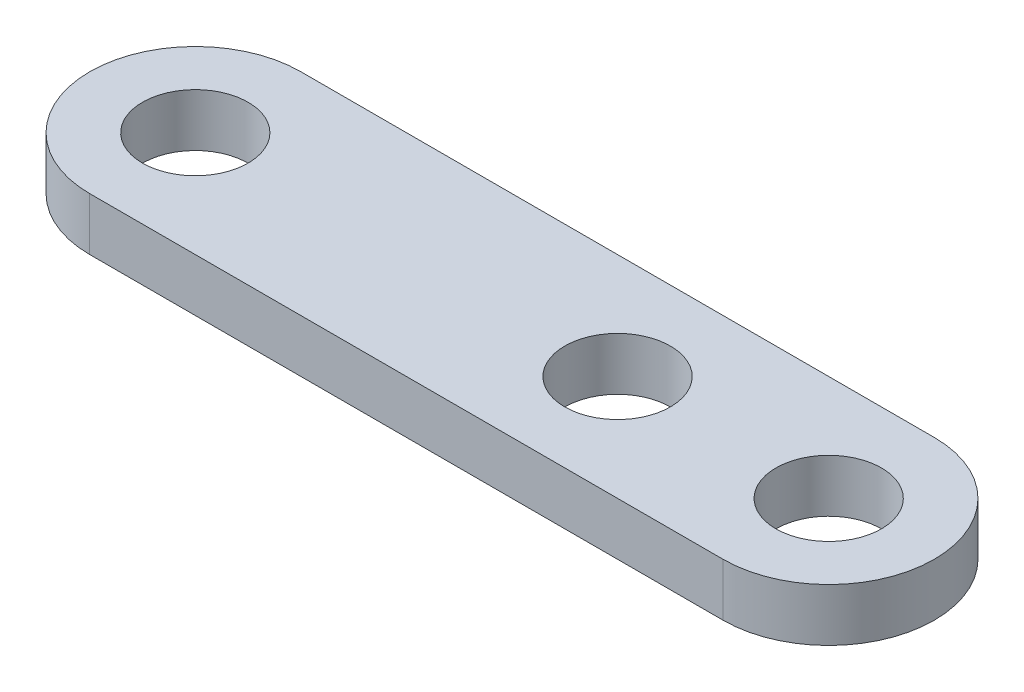
ISO-10303-21;
HEADER;
FILE_DESCRIPTION(('STEP AP214'),'2;1');
FILE_NAME('part.step','',(''),(''),'','','');
FILE_SCHEMA(('AUTOMOTIVE_DESIGN { 1 0 10303 214 1 1 1 1 }'));
ENDSEC;
DATA;
#1=APPLICATION_CONTEXT('core data for automotive mechanical design processes');
#2=APPLICATION_PROTOCOL_DEFINITION('international standard','automotive_design',2000,#1);
#3=PRODUCT_CONTEXT('',#1,'mechanical');
#4=PRODUCT('Part','Part','',(#3));
#5=PRODUCT_RELATED_PRODUCT_CATEGORY('part','',(#4));
#6=PRODUCT_DEFINITION_FORMATION('','',#4);
#7=PRODUCT_DEFINITION_CONTEXT('part definition',#1,'design');
#8=PRODUCT_DEFINITION('design','',#6,#7);
#9=PRODUCT_DEFINITION_SHAPE('','',#8);
#10=(LENGTH_UNIT() NAMED_UNIT(*) SI_UNIT(.MILLI.,.METRE.));
#11=(NAMED_UNIT(*) PLANE_ANGLE_UNIT() SI_UNIT($,.RADIAN.));
#12=(NAMED_UNIT(*) SI_UNIT($,.STERADIAN.) SOLID_ANGLE_UNIT());
#13=UNCERTAINTY_MEASURE_WITH_UNIT(LENGTH_MEASURE(1.E-05),#10,'distance_accuracy_value','');
#14=(GEOMETRIC_REPRESENTATION_CONTEXT(3) GLOBAL_UNCERTAINTY_ASSIGNED_CONTEXT((#13)) GLOBAL_UNIT_ASSIGNED_CONTEXT((#10,
#11,#12)) REPRESENTATION_CONTEXT('',''));
#15=CARTESIAN_POINT('',(0.,0.,0.));
#16=DIRECTION('',(0.,0.,1.));
#17=DIRECTION('',(1.,0.,0.));
#18=AXIS2_PLACEMENT_3D('',#15,#16,#17);
#19=CARTESIAN_POINT('',(-72.3468097091892,5.,0.));
#20=DIRECTION('',(0.,1.,0.));
#21=DIRECTION('',(0.,0.,1.));
#22=AXIS2_PLACEMENT_3D('',#19,#20,#21);
#23=PLANE('',#22);
#24=CARTESIAN_POINT('',(-32.3468097091892,5.,0.));
#25=DIRECTION('',(0.,1.,0.));
#26=DIRECTION('',(0.,0.,1.));
#27=AXIS2_PLACEMENT_3D('',#24,#25,#26);
#28=CIRCLE('',#27,5.);
#29=CARTESIAN_POINT('',(-32.3468097091892,5.,5.));
#30=VERTEX_POINT('',#29);
#31=EDGE_CURVE('E132',#30,#30,#28,.T.);
#32=ORIENTED_EDGE('',*,*,#31,.F.);
#33=EDGE_LOOP('',(#32));
#34=FACE_BOUND('',#33,.T.);
#35=CARTESIAN_POINT('',(-72.3468097091892,5.,0.));
#36=DIRECTION('',(0.,1.,0.));
#37=DIRECTION('',(0.,0.,1.));
#38=AXIS2_PLACEMENT_3D('',#35,#36,#37);
#39=CIRCLE('',#38,5.);
#40=CARTESIAN_POINT('',(-72.3468097091892,5.,5.));
#41=VERTEX_POINT('',#40);
#42=EDGE_CURVE('E109',#41,#41,#39,.T.);
#43=ORIENTED_EDGE('',*,*,#42,.F.);
#44=EDGE_LOOP('',(#43));
#45=FACE_BOUND('',#44,.T.);
#46=CARTESIAN_POINT('',(-72.3468097091892,5.,0.));
#47=DIRECTION('',(0.,1.,0.));
#48=DIRECTION('',(0.,0.,1.));
#49=AXIS2_PLACEMENT_3D('',#46,#47,#48);
#50=CIRCLE('',#49,10.);
#51=CARTESIAN_POINT('',(-72.3468097091892,5.,-10.));
#52=VERTEX_POINT('',#51);
#53=CARTESIAN_POINT('',(-72.3468097091892,5.,10.));
#54=VERTEX_POINT('',#53);
#55=EDGE_CURVE('E93',#52,#54,#50,.T.);
#56=ORIENTED_EDGE('',*,*,#55,.T.);
#57=DIRECTION('',(1.,0.,0.));
#58=VECTOR('',#57,1.);
#59=CARTESIAN_POINT('',(-72.3468097091892,5.,10.));
#60=LINE('',#59,#58);
#61=CARTESIAN_POINT('',(-12.3468097091892,5.,10.));
#62=VERTEX_POINT('',#61);
#63=EDGE_CURVE('E88',#54,#62,#60,.T.);
#64=ORIENTED_EDGE('',*,*,#63,.T.);
#65=CARTESIAN_POINT('',(-12.3468097091892,5.,0.));
#66=DIRECTION('',(0.,1.,0.));
#67=DIRECTION('',(0.,0.,1.));
#68=AXIS2_PLACEMENT_3D('',#65,#66,#67);
#69=CIRCLE('',#68,10.);
#70=CARTESIAN_POINT('',(-12.3468097091892,5.,-10.));
#71=VERTEX_POINT('',#70);
#72=EDGE_CURVE('E91',#62,#71,#69,.T.);
#73=ORIENTED_EDGE('',*,*,#72,.T.);
#74=DIRECTION('',(-1.,0.,0.));
#75=VECTOR('',#74,1.);
#76=CARTESIAN_POINT('',(-72.3468097091892,5.,-10.));
#77=LINE('',#76,#75);
#78=EDGE_CURVE('E58',#71,#52,#77,.T.);
#79=ORIENTED_EDGE('',*,*,#78,.T.);
#80=EDGE_LOOP('',(#56,#64,#73,#79));
#81=FACE_BOUND('',#80,.T.);
#82=CARTESIAN_POINT('',(-12.3468097091892,5.,0.));
#83=DIRECTION('',(0.,1.,0.));
#84=DIRECTION('',(0.,0.,1.));
#85=AXIS2_PLACEMENT_3D('',#82,#83,#84);
#86=CIRCLE('',#85,4.99999999999999);
#87=CARTESIAN_POINT('',(-12.3468097091892,5.,4.99999999999999));
#88=VERTEX_POINT('',#87);
#89=EDGE_CURVE('E124',#88,#88,#86,.T.);
#90=ORIENTED_EDGE('',*,*,#89,.F.);
#91=EDGE_LOOP('',(#90));
#92=FACE_BOUND('',#91,.T.);
#93=ADVANCED_FACE('F40',(#34,#45,#81,#92),#23,.T.);
#94=CARTESIAN_POINT('',(-72.3468097091892,0.,0.));
#95=DIRECTION('',(0.,1.,0.));
#96=DIRECTION('',(0.,0.,1.));
#97=AXIS2_PLACEMENT_3D('',#94,#95,#96);
#98=PLANE('',#97);
#99=CARTESIAN_POINT('',(-32.3468097091892,0.,0.));
#100=DIRECTION('',(0.,1.,0.));
#101=DIRECTION('',(0.,0.,1.));
#102=AXIS2_PLACEMENT_3D('',#99,#100,#101);
#103=CIRCLE('',#102,5.);
#104=CARTESIAN_POINT('',(-32.3468097091892,0.,5.));
#105=VERTEX_POINT('',#104);
#106=EDGE_CURVE('E44',#105,#105,#103,.T.);
#107=ORIENTED_EDGE('',*,*,#106,.T.);
#108=EDGE_LOOP('',(#107));
#109=FACE_BOUND('',#108,.T.);
#110=CARTESIAN_POINT('',(-72.3468097091892,0.,0.));
#111=DIRECTION('',(0.,1.,0.));
#112=DIRECTION('',(0.,0.,1.));
#113=AXIS2_PLACEMENT_3D('',#110,#111,#112);
#114=CIRCLE('',#113,10.);
#115=CARTESIAN_POINT('',(-72.3468097091892,0.,-10.));
#116=VERTEX_POINT('',#115);
#117=CARTESIAN_POINT('',(-72.3468097091892,0.,10.));
#118=VERTEX_POINT('',#117);
#119=EDGE_CURVE('E106',#116,#118,#114,.T.);
#120=ORIENTED_EDGE('',*,*,#119,.F.);
#121=DIRECTION('',(-1.,0.,0.));
#122=VECTOR('',#121,1.);
#123=CARTESIAN_POINT('',(-72.3468097091892,0.,-10.));
#124=LINE('',#123,#122);
#125=CARTESIAN_POINT('',(-12.3468097091892,0.,-10.));
#126=VERTEX_POINT('',#125);
#127=EDGE_CURVE('E81',#126,#116,#124,.T.);
#128=ORIENTED_EDGE('',*,*,#127,.F.);
#129=CARTESIAN_POINT('',(-12.3468097091892,0.,0.));
#130=DIRECTION('',(0.,1.,0.));
#131=DIRECTION('',(0.,0.,1.));
#132=AXIS2_PLACEMENT_3D('',#129,#130,#131);
#133=CIRCLE('',#132,10.);
#134=CARTESIAN_POINT('',(-12.3468097091892,0.,10.));
#135=VERTEX_POINT('',#134);
#136=EDGE_CURVE('E75',#135,#126,#133,.T.);
#137=ORIENTED_EDGE('',*,*,#136,.F.);
#138=DIRECTION('',(1.,0.,0.));
#139=VECTOR('',#138,1.);
#140=CARTESIAN_POINT('',(-72.3468097091892,0.,10.));
#141=LINE('',#140,#139);
#142=EDGE_CURVE('E97',#118,#135,#141,.T.);
#143=ORIENTED_EDGE('',*,*,#142,.F.);
#144=EDGE_LOOP('',(#120,#128,#137,#143));
#145=FACE_BOUND('',#144,.T.);
#146=CARTESIAN_POINT('',(-72.3468097091892,0.,0.));
#147=DIRECTION('',(0.,1.,0.));
#148=DIRECTION('',(0.,0.,1.));
#149=AXIS2_PLACEMENT_3D('',#146,#147,#148);
#150=CIRCLE('',#149,5.);
#151=CARTESIAN_POINT('',(-72.3468097091892,0.,5.));
#152=VERTEX_POINT('',#151);
#153=EDGE_CURVE('E121',#152,#152,#150,.T.);
#154=ORIENTED_EDGE('',*,*,#153,.T.);
#155=EDGE_LOOP('',(#154));
#156=FACE_BOUND('',#155,.T.);
#157=CARTESIAN_POINT('',(-12.3468097091892,0.,0.));
#158=DIRECTION('',(0.,1.,0.));
#159=DIRECTION('',(0.,0.,1.));
#160=AXIS2_PLACEMENT_3D('',#157,#158,#159);
#161=CIRCLE('',#160,4.99999999999999);
#162=CARTESIAN_POINT('',(-12.3468097091892,0.,4.99999999999999));
#163=VERTEX_POINT('',#162);
#164=EDGE_CURVE('E127',#163,#163,#161,.T.);
#165=ORIENTED_EDGE('',*,*,#164,.T.);
#166=EDGE_LOOP('',(#165));
#167=FACE_BOUND('',#166,.T.);
#168=ADVANCED_FACE('F117',(#109,#145,#156,#167),#98,.F.);
#169=CARTESIAN_POINT('',(-72.3468097091892,5.,0.));
#170=DIRECTION('',(0.,-1.,0.));
#171=DIRECTION('',(0.,0.,-1.));
#172=AXIS2_PLACEMENT_3D('',#169,#170,#171);
#173=CYLINDRICAL_SURFACE('',#172,10.);
#174=ORIENTED_EDGE('',*,*,#119,.T.);
#175=DIRECTION('',(0.,-1.,0.));
#176=VECTOR('',#175,1.);
#177=CARTESIAN_POINT('',(-72.3468097091892,5.,10.));
#178=LINE('',#177,#176);
#179=EDGE_CURVE('E11',#54,#118,#178,.T.);
#180=ORIENTED_EDGE('',*,*,#179,.F.);
#181=ORIENTED_EDGE('',*,*,#55,.F.);
#182=DIRECTION('',(0.,-1.,0.));
#183=VECTOR('',#182,1.);
#184=CARTESIAN_POINT('',(-72.3468097091892,5.,-10.));
#185=LINE('',#184,#183);
#186=EDGE_CURVE('E102',#52,#116,#185,.T.);
#187=ORIENTED_EDGE('',*,*,#186,.T.);
#188=EDGE_LOOP('',(#174,#180,#181,#187));
#189=FACE_BOUND('',#188,.T.);
#190=ADVANCED_FACE('F42',(#189),#173,.T.);
#191=CARTESIAN_POINT('',(-72.3468097091892,5.,10.));
#192=DIRECTION('',(0.,0.,-1.));
#193=DIRECTION('',(-1.,0.,0.));
#194=AXIS2_PLACEMENT_3D('',#191,#192,#193);
#195=PLANE('',#194);
#196=ORIENTED_EDGE('',*,*,#142,.T.);
#197=DIRECTION('',(0.,-1.,0.));
#198=VECTOR('',#197,1.);
#199=CARTESIAN_POINT('',(-12.3468097091892,5.,10.));
#200=LINE('',#199,#198);
#201=EDGE_CURVE('E50',#62,#135,#200,.T.);
#202=ORIENTED_EDGE('',*,*,#201,.F.);
#203=ORIENTED_EDGE('',*,*,#63,.F.);
#204=ORIENTED_EDGE('',*,*,#179,.T.);
#205=EDGE_LOOP('',(#196,#202,#203,#204));
#206=FACE_BOUND('',#205,.T.);
#207=ADVANCED_FACE('F96',(#206),#195,.F.);
#208=CARTESIAN_POINT('',(-12.3468097091892,5.,0.));
#209=DIRECTION('',(0.,-1.,0.));
#210=DIRECTION('',(0.,0.,-1.));
#211=AXIS2_PLACEMENT_3D('',#208,#209,#210);
#212=CYLINDRICAL_SURFACE('',#211,10.);
#213=ORIENTED_EDGE('',*,*,#136,.T.);
#214=DIRECTION('',(0.,-1.,0.));
#215=VECTOR('',#214,1.);
#216=CARTESIAN_POINT('',(-12.3468097091892,5.,-10.));
#217=LINE('',#216,#215);
#218=EDGE_CURVE('E98',#71,#126,#217,.T.);
#219=ORIENTED_EDGE('',*,*,#218,.F.);
#220=ORIENTED_EDGE('',*,*,#72,.F.);
#221=ORIENTED_EDGE('',*,*,#201,.T.);
#222=EDGE_LOOP('',(#213,#219,#220,#221));
#223=FACE_BOUND('',#222,.T.);
#224=ADVANCED_FACE('F100',(#223),#212,.T.);
#225=CARTESIAN_POINT('',(-72.3468097091892,5.,-10.));
#226=DIRECTION('',(0.,0.,1.));
#227=DIRECTION('',(1.,0.,0.));
#228=AXIS2_PLACEMENT_3D('',#225,#226,#227);
#229=PLANE('',#228);
#230=ORIENTED_EDGE('',*,*,#127,.T.);
#231=ORIENTED_EDGE('',*,*,#186,.F.);
#232=ORIENTED_EDGE('',*,*,#78,.F.);
#233=ORIENTED_EDGE('',*,*,#218,.T.);
#234=EDGE_LOOP('',(#230,#231,#232,#233));
#235=FACE_BOUND('',#234,.T.);
#236=ADVANCED_FACE('F114',(#235),#229,.F.);
#237=CARTESIAN_POINT('',(-72.3468097091892,5.,0.));
#238=DIRECTION('',(0.,-1.,0.));
#239=DIRECTION('',(0.,0.,-1.));
#240=AXIS2_PLACEMENT_3D('',#237,#238,#239);
#241=CYLINDRICAL_SURFACE('',#240,5.);
#242=ORIENTED_EDGE('',*,*,#42,.T.);
#243=EDGE_LOOP('',(#242));
#244=FACE_BOUND('',#243,.T.);
#245=ORIENTED_EDGE('',*,*,#153,.F.);
#246=EDGE_LOOP('',(#245));
#247=FACE_BOUND('',#246,.T.);
#248=ADVANCED_FACE('F147',(#244,#247),#241,.F.);
#249=CARTESIAN_POINT('',(-12.3468097091892,5.,0.));
#250=DIRECTION('',(0.,-1.,0.));
#251=DIRECTION('',(0.,0.,-1.));
#252=AXIS2_PLACEMENT_3D('',#249,#250,#251);
#253=CYLINDRICAL_SURFACE('',#252,4.99999999999999);
#254=ORIENTED_EDGE('',*,*,#89,.T.);
#255=EDGE_LOOP('',(#254));
#256=FACE_BOUND('',#255,.T.);
#257=ORIENTED_EDGE('',*,*,#164,.F.);
#258=EDGE_LOOP('',(#257));
#259=FACE_BOUND('',#258,.T.);
#260=ADVANCED_FACE('F142',(#256,#259),#253,.F.);
#261=CARTESIAN_POINT('',(-32.3468097091892,-5.,0.));
#262=DIRECTION('',(0.,1.,0.));
#263=DIRECTION('',(0.,0.,1.));
#264=AXIS2_PLACEMENT_3D('',#261,#262,#263);
#265=CYLINDRICAL_SURFACE('',#264,5.);
#266=ORIENTED_EDGE('',*,*,#31,.T.);
#267=EDGE_LOOP('',(#266));
#268=FACE_BOUND('',#267,.T.);
#269=ORIENTED_EDGE('',*,*,#106,.F.);
#270=EDGE_LOOP('',(#269));
#271=FACE_BOUND('',#270,.T.);
#272=ADVANCED_FACE('F140',(#268,#271),#265,.F.);
#273=CLOSED_SHELL('',(#93,#168,#190,#207,#224,#236,#248,#260,#272));
#274=MANIFOLD_SOLID_BREP('B2',#273);
#275=ADVANCED_BREP_SHAPE_REPRESENTATION('',(#18,#274),#14);
#276=SHAPE_DEFINITION_REPRESENTATION(#9,#275);
ENDSEC;
END-ISO-10303-21;
